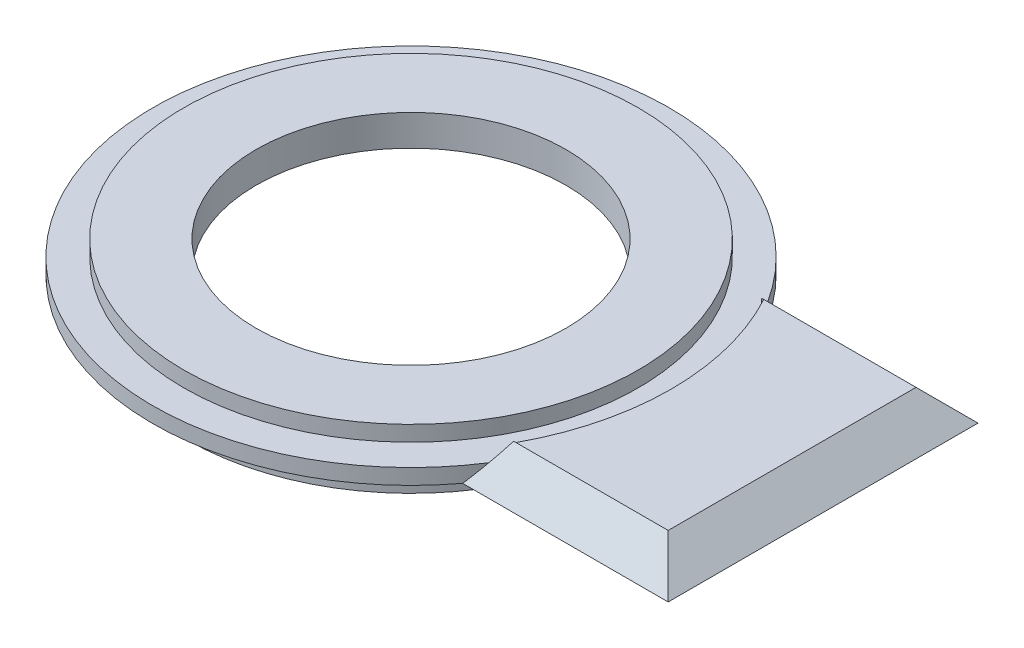
ISO-10303-21;
HEADER;
FILE_DESCRIPTION(('STEP AP214'),'2;1');
FILE_NAME('part.step','',(''),(''),'','','');
FILE_SCHEMA(('AUTOMOTIVE_DESIGN { 1 0 10303 214 1 1 1 1 }'));
ENDSEC;
DATA;
#1=APPLICATION_CONTEXT('core data for automotive mechanical design processes');
#2=APPLICATION_PROTOCOL_DEFINITION('international standard','automotive_design',2000,#1);
#3=PRODUCT_CONTEXT('',#1,'mechanical');
#4=PRODUCT('Part','Part','',(#3));
#5=PRODUCT_RELATED_PRODUCT_CATEGORY('part','',(#4));
#6=PRODUCT_DEFINITION_FORMATION('','',#4);
#7=PRODUCT_DEFINITION_CONTEXT('part definition',#1,'design');
#8=PRODUCT_DEFINITION('design','',#6,#7);
#9=PRODUCT_DEFINITION_SHAPE('','',#8);
#10=(LENGTH_UNIT() NAMED_UNIT(*) SI_UNIT(.MILLI.,.METRE.));
#11=(NAMED_UNIT(*) PLANE_ANGLE_UNIT() SI_UNIT($,.RADIAN.));
#12=(NAMED_UNIT(*) SI_UNIT($,.STERADIAN.) SOLID_ANGLE_UNIT());
#13=UNCERTAINTY_MEASURE_WITH_UNIT(LENGTH_MEASURE(1.E-05),#10,'distance_accuracy_value','');
#14=(GEOMETRIC_REPRESENTATION_CONTEXT(3) GLOBAL_UNCERTAINTY_ASSIGNED_CONTEXT((#13)) GLOBAL_UNIT_ASSIGNED_CONTEXT((#10,
#11,#12)) REPRESENTATION_CONTEXT('',''));
#15=CARTESIAN_POINT('',(0.,0.,0.));
#16=DIRECTION('',(0.,0.,1.));
#17=DIRECTION('',(1.,0.,0.));
#18=AXIS2_PLACEMENT_3D('',#15,#16,#17);
#19=CARTESIAN_POINT('',(0.,3.,0.));
#20=DIRECTION('',(0.,-1.,0.));
#21=DIRECTION('',(0.,0.,-1.));
#22=AXIS2_PLACEMENT_3D('',#19,#20,#21);
#23=CYLINDRICAL_SURFACE('',#22,25.);
#24=CARTESIAN_POINT('',(0.,1.5,0.));
#25=DIRECTION('',(0.,1.,0.));
#26=DIRECTION('',(0.,0.,1.));
#27=AXIS2_PLACEMENT_3D('',#24,#25,#26);
#28=CIRCLE('',#27,25.);
#29=CARTESIAN_POINT('',(21.0416254125008,1.5,-13.5));
#30=VERTEX_POINT('',#29);
#31=CARTESIAN_POINT('',(21.0416254125008,1.5,13.5));
#32=VERTEX_POINT('',#31);
#33=EDGE_CURVE('E196',#30,#32,#28,.T.);
#34=ORIENTED_EDGE('',*,*,#33,.F.);
#35=CARTESIAN_POINT('',(0.,15.,0.));
#36=DIRECTION('',(0.,0.707106781186547,-0.707106781186548));
#37=DIRECTION('',(0.,-0.707106781186548,-0.707106781186547));
#38=AXIS2_PLACEMENT_3D('',#35,#36,#37);
#39=ELLIPSE('',#38,35.3553390593274,25.);
#40=CARTESIAN_POINT('',(20.,0.,-15.));
#41=VERTEX_POINT('',#40);
#42=EDGE_CURVE('E51',#30,#41,#39,.T.);
#43=ORIENTED_EDGE('',*,*,#42,.T.);
#44=CARTESIAN_POINT('',(0.,0.,0.));
#45=DIRECTION('',(0.,1.,0.));
#46=DIRECTION('',(0.,0.,1.));
#47=AXIS2_PLACEMENT_3D('',#44,#45,#46);
#48=CIRCLE('',#47,25.);
#49=CARTESIAN_POINT('',(20.,0.,15.));
#50=VERTEX_POINT('',#49);
#51=EDGE_CURVE('E308',#41,#50,#48,.T.);
#52=ORIENTED_EDGE('',*,*,#51,.T.);
#53=CARTESIAN_POINT('',(0.,15.,0.));
#54=DIRECTION('',(0.,0.707106781186547,0.707106781186548));
#55=DIRECTION('',(0.,-0.707106781186548,0.707106781186547));
#56=AXIS2_PLACEMENT_3D('',#53,#54,#55);
#57=ELLIPSE('',#56,35.3553390593274,25.);
#58=EDGE_CURVE('E334',#50,#32,#57,.T.);
#59=ORIENTED_EDGE('',*,*,#58,.T.);
#60=EDGE_LOOP('',(#34,#43,#52,#59));
#61=FACE_BOUND('',#60,.T.);
#62=ADVANCED_FACE('F40',(#61),#23,.T.);
#63=CARTESIAN_POINT('',(0.,3.,0.));
#64=DIRECTION('',(0.,1.,0.));
#65=DIRECTION('',(0.,0.,1.));
#66=AXIS2_PLACEMENT_3D('',#63,#64,#65);
#67=PLANE('',#66);
#68=CARTESIAN_POINT('',(0.,3.,0.));
#69=DIRECTION('',(0.,-1.,0.));
#70=DIRECTION('',(0.,0.,-1.));
#71=AXIS2_PLACEMENT_3D('',#68,#69,#70);
#72=CIRCLE('',#71,15.);
#73=CARTESIAN_POINT('',(0.,3.,-15.));
#74=VERTEX_POINT('',#73);
#75=EDGE_CURVE('E215',#74,#74,#72,.T.);
#76=ORIENTED_EDGE('',*,*,#75,.T.);
#77=EDGE_LOOP('',(#76));
#78=FACE_BOUND('',#77,.T.);
#79=CARTESIAN_POINT('',(0.,3.,0.));
#80=DIRECTION('',(0.,1.,0.));
#81=DIRECTION('',(0.,0.,1.));
#82=AXIS2_PLACEMENT_3D('',#79,#80,#81);
#83=CIRCLE('',#82,22.);
#84=CARTESIAN_POINT('',(0.,3.,22.));
#85=VERTEX_POINT('',#84);
#86=EDGE_CURVE('E197',#85,#85,#83,.T.);
#87=ORIENTED_EDGE('',*,*,#86,.T.);
#88=EDGE_LOOP('',(#87));
#89=FACE_BOUND('',#88,.T.);
#90=ADVANCED_FACE('F385',(#78,#89),#67,.T.);
#91=CARTESIAN_POINT('',(0.,0.,0.));
#92=DIRECTION('',(0.,1.,0.));
#93=DIRECTION('',(0.,0.,1.));
#94=AXIS2_PLACEMENT_3D('',#91,#92,#93);
#95=PLANE('',#94);
#96=ORIENTED_EDGE('',*,*,#51,.F.);
#97=DIRECTION('',(-1.,0.,0.));
#98=VECTOR('',#97,1.);
#99=CARTESIAN_POINT('',(20.,0.,-15.));
#100=LINE('',#99,#98);
#101=CARTESIAN_POINT('',(39.9,0.,-15.));
#102=VERTEX_POINT('',#101);
#103=EDGE_CURVE('E320',#102,#41,#100,.T.);
#104=ORIENTED_EDGE('',*,*,#103,.F.);
#105=DIRECTION('',(0.,0.,-1.));
#106=VECTOR('',#105,1.);
#107=CARTESIAN_POINT('',(39.9,0.,-15.));
#108=LINE('',#107,#106);
#109=CARTESIAN_POINT('',(39.9,0.,15.));
#110=VERTEX_POINT('',#109);
#111=EDGE_CURVE('E316',#110,#102,#108,.T.);
#112=ORIENTED_EDGE('',*,*,#111,.F.);
#113=DIRECTION('',(1.,0.,0.));
#114=VECTOR('',#113,1.);
#115=CARTESIAN_POINT('',(39.9,0.,15.));
#116=LINE('',#115,#114);
#117=EDGE_CURVE('E312',#50,#110,#116,.T.);
#118=ORIENTED_EDGE('',*,*,#117,.F.);
#119=EDGE_LOOP('',(#96,#104,#112,#118));
#120=FACE_BOUND('',#119,.T.);
#121=CARTESIAN_POINT('',(0.,0.,0.));
#122=DIRECTION('',(0.,-1.,0.));
#123=DIRECTION('',(0.,0.,-1.));
#124=AXIS2_PLACEMENT_3D('',#121,#122,#123);
#125=CIRCLE('',#124,21.7);
#126=CARTESIAN_POINT('',(18.2756668824971,0.,11.7));
#127=VERTEX_POINT('',#126);
#128=CARTESIAN_POINT('',(18.2756668824971,0.,-11.7));
#129=VERTEX_POINT('',#128);
#130=EDGE_CURVE('E263',#127,#129,#125,.T.);
#131=ORIENTED_EDGE('',*,*,#130,.F.);
#132=DIRECTION('',(-1.,0.,0.));
#133=VECTOR('',#132,1.);
#134=CARTESIAN_POINT('',(36.6,0.,11.7));
#135=LINE('',#134,#133);
#136=CARTESIAN_POINT('',(36.6,0.,11.7));
#137=VERTEX_POINT('',#136);
#138=EDGE_CURVE('E269',#137,#127,#135,.T.);
#139=ORIENTED_EDGE('',*,*,#138,.F.);
#140=DIRECTION('',(0.,0.,1.));
#141=VECTOR('',#140,1.);
#142=CARTESIAN_POINT('',(36.6,0.,-11.7));
#143=LINE('',#142,#141);
#144=CARTESIAN_POINT('',(36.6,0.,-11.7));
#145=VERTEX_POINT('',#144);
#146=EDGE_CURVE('E286',#145,#137,#143,.T.);
#147=ORIENTED_EDGE('',*,*,#146,.F.);
#148=DIRECTION('',(1.,0.,0.));
#149=VECTOR('',#148,1.);
#150=CARTESIAN_POINT('',(18.2756668824971,0.,-11.7));
#151=LINE('',#150,#149);
#152=EDGE_CURVE('E282',#129,#145,#151,.T.);
#153=ORIENTED_EDGE('',*,*,#152,.F.);
#154=EDGE_LOOP('',(#131,#139,#147,#153));
#155=FACE_BOUND('',#154,.T.);
#156=ADVANCED_FACE('F363',(#120,#155),#95,.F.);
#157=CARTESIAN_POINT('',(0.,3.,0.));
#158=DIRECTION('',(0.,1.,0.));
#159=DIRECTION('',(0.,0.,1.));
#160=AXIS2_PLACEMENT_3D('',#157,#158,#159);
#161=CIRCLE('',#160,25.2);
#162=CARTESIAN_POINT('',(22.1594223751433,3.,12.));
#163=VERTEX_POINT('',#162);
#164=CARTESIAN_POINT('',(22.1594223751433,3.,-12.));
#165=VERTEX_POINT('',#164);
#166=EDGE_CURVE('E201',#163,#165,#161,.T.);
#167=ORIENTED_EDGE('',*,*,#166,.F.);
#168=DIRECTION('',(1.,0.,0.));
#169=VECTOR('',#168,1.);
#170=CARTESIAN_POINT('',(39.9,3.,12.));
#171=LINE('',#170,#169);
#172=CARTESIAN_POINT('',(36.9,3.,12.));
#173=VERTEX_POINT('',#172);
#174=EDGE_CURVE('E67',#163,#173,#171,.T.);
#175=ORIENTED_EDGE('',*,*,#174,.T.);
#176=DIRECTION('',(0.,0.,-1.));
#177=VECTOR('',#176,1.);
#178=CARTESIAN_POINT('',(36.9,3.,-15.));
#179=LINE('',#178,#177);
#180=CARTESIAN_POINT('',(36.9,3.,-12.));
#181=VERTEX_POINT('',#180);
#182=EDGE_CURVE('E328',#173,#181,#179,.T.);
#183=ORIENTED_EDGE('',*,*,#182,.T.);
#184=DIRECTION('',(-1.,0.,0.));
#185=VECTOR('',#184,1.);
#186=CARTESIAN_POINT('',(20.,3.,-12.));
#187=LINE('',#186,#185);
#188=EDGE_CURVE('E324',#181,#165,#187,.T.);
#189=ORIENTED_EDGE('',*,*,#188,.T.);
#190=EDGE_LOOP('',(#167,#175,#183,#189));
#191=FACE_BOUND('',#190,.T.);
#192=ADVANCED_FACE('F352',(#191),#67,.T.);
#193=CARTESIAN_POINT('',(0.,-3.,0.));
#194=DIRECTION('',(0.,-1.,0.));
#195=DIRECTION('',(0.,0.,-1.));
#196=AXIS2_PLACEMENT_3D('',#193,#194,#195);
#197=PLANE('',#196);
#198=CARTESIAN_POINT('',(0.,-3.,0.));
#199=DIRECTION('',(0.,-1.,0.));
#200=DIRECTION('',(0.,0.,-1.));
#201=AXIS2_PLACEMENT_3D('',#198,#199,#200);
#202=CIRCLE('',#201,21.7);
#203=CARTESIAN_POINT('',(18.2756668824971,-3.,11.7));
#204=VERTEX_POINT('',#203);
#205=CARTESIAN_POINT('',(18.2756668824971,-3.,-11.7));
#206=VERTEX_POINT('',#205);
#207=EDGE_CURVE('E264',#204,#206,#202,.T.);
#208=ORIENTED_EDGE('',*,*,#207,.T.);
#209=DIRECTION('',(1.,0.,0.));
#210=VECTOR('',#209,1.);
#211=CARTESIAN_POINT('',(18.2756668824971,-3.,-11.7));
#212=LINE('',#211,#210);
#213=CARTESIAN_POINT('',(36.6,-3.,-11.7));
#214=VERTEX_POINT('',#213);
#215=EDGE_CURVE('E268',#206,#214,#212,.T.);
#216=ORIENTED_EDGE('',*,*,#215,.T.);
#217=DIRECTION('',(0.,0.,1.));
#218=VECTOR('',#217,1.);
#219=CARTESIAN_POINT('',(36.6,-3.,-11.7));
#220=LINE('',#219,#218);
#221=CARTESIAN_POINT('',(36.6,-3.,11.7));
#222=VERTEX_POINT('',#221);
#223=EDGE_CURVE('E272',#214,#222,#220,.T.);
#224=ORIENTED_EDGE('',*,*,#223,.T.);
#225=DIRECTION('',(-1.,0.,0.));
#226=VECTOR('',#225,1.);
#227=CARTESIAN_POINT('',(36.6,-3.,11.7));
#228=LINE('',#227,#226);
#229=EDGE_CURVE('E275',#222,#204,#228,.T.);
#230=ORIENTED_EDGE('',*,*,#229,.T.);
#231=EDGE_LOOP('',(#208,#216,#224,#230));
#232=FACE_BOUND('',#231,.T.);
#233=DIRECTION('',(1.,0.,0.));
#234=VECTOR('',#233,1.);
#235=CARTESIAN_POINT('',(17.1464281994822,-3.,-9.7));
#236=LINE('',#235,#234);
#237=CARTESIAN_POINT('',(17.1464281994822,-3.,-9.7));
#238=VERTEX_POINT('',#237);
#239=CARTESIAN_POINT('',(34.6,-3.,-9.7));
#240=VERTEX_POINT('',#239);
#241=EDGE_CURVE('E226',#238,#240,#236,.T.);
#242=ORIENTED_EDGE('',*,*,#241,.F.);
#243=CARTESIAN_POINT('',(0.,-3.,0.));
#244=DIRECTION('',(0.,-1.,0.));
#245=DIRECTION('',(0.,0.,-1.));
#246=AXIS2_PLACEMENT_3D('',#243,#244,#245);
#247=CIRCLE('',#246,19.7);
#248=CARTESIAN_POINT('',(17.1464281994822,-3.,9.7));
#249=VERTEX_POINT('',#248);
#250=EDGE_CURVE('E223',#249,#238,#247,.T.);
#251=ORIENTED_EDGE('',*,*,#250,.F.);
#252=DIRECTION('',(-1.,0.,0.));
#253=VECTOR('',#252,1.);
#254=CARTESIAN_POINT('',(34.6,-3.,9.7));
#255=LINE('',#254,#253);
#256=CARTESIAN_POINT('',(34.6,-3.,9.7));
#257=VERTEX_POINT('',#256);
#258=EDGE_CURVE('E234',#257,#249,#255,.T.);
#259=ORIENTED_EDGE('',*,*,#258,.F.);
#260=DIRECTION('',(0.,0.,1.));
#261=VECTOR('',#260,1.);
#262=CARTESIAN_POINT('',(34.6,-3.,-9.7));
#263=LINE('',#262,#261);
#264=EDGE_CURVE('E230',#240,#257,#263,.T.);
#265=ORIENTED_EDGE('',*,*,#264,.F.);
#266=EDGE_LOOP('',(#242,#251,#259,#265));
#267=FACE_BOUND('',#266,.T.);
#268=ADVANCED_FACE('F437',(#232,#267),#197,.T.);
#269=CARTESIAN_POINT('',(0.,-3.,0.));
#270=DIRECTION('',(0.,1.,0.));
#271=DIRECTION('',(0.,0.,1.));
#272=AXIS2_PLACEMENT_3D('',#269,#270,#271);
#273=CYLINDRICAL_SURFACE('',#272,21.7);
#274=ORIENTED_EDGE('',*,*,#130,.T.);
#275=DIRECTION('',(0.,1.,0.));
#276=VECTOR('',#275,1.);
#277=CARTESIAN_POINT('',(18.2756668824971,-3.,-11.7));
#278=LINE('',#277,#276);
#279=EDGE_CURVE('E304',#206,#129,#278,.T.);
#280=ORIENTED_EDGE('',*,*,#279,.F.);
#281=ORIENTED_EDGE('',*,*,#207,.F.);
#282=DIRECTION('',(0.,1.,0.));
#283=VECTOR('',#282,1.);
#284=CARTESIAN_POINT('',(18.2756668824971,-3.,11.7));
#285=LINE('',#284,#283);
#286=EDGE_CURVE('E278',#204,#127,#285,.T.);
#287=ORIENTED_EDGE('',*,*,#286,.T.);
#288=EDGE_LOOP('',(#274,#280,#281,#287));
#289=FACE_BOUND('',#288,.T.);
#290=ADVANCED_FACE('F440',(#289),#273,.T.);
#291=CARTESIAN_POINT('',(18.2756668824971,-3.,-11.7));
#292=DIRECTION('',(0.,0.,1.));
#293=DIRECTION('',(1.,0.,0.));
#294=AXIS2_PLACEMENT_3D('',#291,#292,#293);
#295=PLANE('',#294);
#296=ORIENTED_EDGE('',*,*,#152,.T.);
#297=DIRECTION('',(0.,1.,0.));
#298=VECTOR('',#297,1.);
#299=CARTESIAN_POINT('',(36.6,-3.,-11.7));
#300=LINE('',#299,#298);
#301=EDGE_CURVE('E300',#214,#145,#300,.T.);
#302=ORIENTED_EDGE('',*,*,#301,.F.);
#303=ORIENTED_EDGE('',*,*,#215,.F.);
#304=ORIENTED_EDGE('',*,*,#279,.T.);
#305=EDGE_LOOP('',(#296,#302,#303,#304));
#306=FACE_BOUND('',#305,.T.);
#307=ADVANCED_FACE('F448',(#306),#295,.F.);
#308=CARTESIAN_POINT('',(36.6,-3.,-11.7));
#309=DIRECTION('',(-1.,0.,0.));
#310=DIRECTION('',(0.,0.,1.));
#311=AXIS2_PLACEMENT_3D('',#308,#309,#310);
#312=PLANE('',#311);
#313=ORIENTED_EDGE('',*,*,#146,.T.);
#314=DIRECTION('',(0.,1.,0.));
#315=VECTOR('',#314,1.);
#316=CARTESIAN_POINT('',(36.6,-3.,11.7));
#317=LINE('',#316,#315);
#318=EDGE_CURVE('E296',#222,#137,#317,.T.);
#319=ORIENTED_EDGE('',*,*,#318,.F.);
#320=ORIENTED_EDGE('',*,*,#223,.F.);
#321=ORIENTED_EDGE('',*,*,#301,.T.);
#322=EDGE_LOOP('',(#313,#319,#320,#321));
#323=FACE_BOUND('',#322,.T.);
#324=ADVANCED_FACE('F444',(#323),#312,.F.);
#325=CARTESIAN_POINT('',(36.6,-3.,11.7));
#326=DIRECTION('',(0.,0.,-1.));
#327=DIRECTION('',(-1.,0.,0.));
#328=AXIS2_PLACEMENT_3D('',#325,#326,#327);
#329=PLANE('',#328);
#330=ORIENTED_EDGE('',*,*,#138,.T.);
#331=ORIENTED_EDGE('',*,*,#286,.F.);
#332=ORIENTED_EDGE('',*,*,#229,.F.);
#333=ORIENTED_EDGE('',*,*,#318,.T.);
#334=EDGE_LOOP('',(#330,#331,#332,#333));
#335=FACE_BOUND('',#334,.T.);
#336=ADVANCED_FACE('F435',(#335),#329,.F.);
#337=CARTESIAN_POINT('',(0.,-3.,0.));
#338=DIRECTION('',(0.,1.,0.));
#339=DIRECTION('',(0.,0.,1.));
#340=AXIS2_PLACEMENT_3D('',#337,#338,#339);
#341=CYLINDRICAL_SURFACE('',#340,19.7);
#342=CARTESIAN_POINT('',(0.,0.,0.));
#343=DIRECTION('',(0.,-1.,0.));
#344=DIRECTION('',(0.,0.,-1.));
#345=AXIS2_PLACEMENT_3D('',#342,#343,#344);
#346=CIRCLE('',#345,19.7);
#347=CARTESIAN_POINT('',(17.1464281994822,0.,9.7));
#348=VERTEX_POINT('',#347);
#349=CARTESIAN_POINT('',(17.1464281994822,0.,-9.7));
#350=VERTEX_POINT('',#349);
#351=EDGE_CURVE('E218',#348,#350,#346,.T.);
#352=ORIENTED_EDGE('',*,*,#351,.F.);
#353=DIRECTION('',(0.,1.,0.));
#354=VECTOR('',#353,1.);
#355=CARTESIAN_POINT('',(17.1464281994822,-3.,9.7));
#356=LINE('',#355,#354);
#357=EDGE_CURVE('E237',#249,#348,#356,.T.);
#358=ORIENTED_EDGE('',*,*,#357,.F.);
#359=ORIENTED_EDGE('',*,*,#250,.T.);
#360=DIRECTION('',(0.,1.,0.));
#361=VECTOR('',#360,1.);
#362=CARTESIAN_POINT('',(17.1464281994822,-3.,-9.7));
#363=LINE('',#362,#361);
#364=EDGE_CURVE('E259',#238,#350,#363,.T.);
#365=ORIENTED_EDGE('',*,*,#364,.T.);
#366=EDGE_LOOP('',(#352,#358,#359,#365));
#367=FACE_BOUND('',#366,.T.);
#368=ADVANCED_FACE('F431',(#367),#341,.F.);
#369=CARTESIAN_POINT('',(17.1464281994822,-3.,-9.7));
#370=DIRECTION('',(0.,0.,1.));
#371=DIRECTION('',(1.,0.,0.));
#372=AXIS2_PLACEMENT_3D('',#369,#370,#371);
#373=PLANE('',#372);
#374=DIRECTION('',(1.,0.,0.));
#375=VECTOR('',#374,1.);
#376=CARTESIAN_POINT('',(17.1464281994822,0.,-9.7));
#377=LINE('',#376,#375);
#378=CARTESIAN_POINT('',(34.6,0.,-9.7));
#379=VERTEX_POINT('',#378);
#380=EDGE_CURVE('E241',#350,#379,#377,.T.);
#381=ORIENTED_EDGE('',*,*,#380,.F.);
#382=ORIENTED_EDGE('',*,*,#364,.F.);
#383=ORIENTED_EDGE('',*,*,#241,.T.);
#384=DIRECTION('',(0.,1.,0.));
#385=VECTOR('',#384,1.);
#386=CARTESIAN_POINT('',(34.6,-3.,-9.7));
#387=LINE('',#386,#385);
#388=EDGE_CURVE('E256',#240,#379,#387,.T.);
#389=ORIENTED_EDGE('',*,*,#388,.T.);
#390=EDGE_LOOP('',(#381,#382,#383,#389));
#391=FACE_BOUND('',#390,.T.);
#392=ADVANCED_FACE('F427',(#391),#373,.T.);
#393=CARTESIAN_POINT('',(34.6,-3.,-9.7));
#394=DIRECTION('',(-1.,0.,0.));
#395=DIRECTION('',(0.,0.,1.));
#396=AXIS2_PLACEMENT_3D('',#393,#394,#395);
#397=PLANE('',#396);
#398=DIRECTION('',(0.,0.,1.));
#399=VECTOR('',#398,1.);
#400=CARTESIAN_POINT('',(34.6,0.,-9.7));
#401=LINE('',#400,#399);
#402=CARTESIAN_POINT('',(34.6,0.,9.7));
#403=VERTEX_POINT('',#402);
#404=EDGE_CURVE('E245',#379,#403,#401,.T.);
#405=ORIENTED_EDGE('',*,*,#404,.F.);
#406=ORIENTED_EDGE('',*,*,#388,.F.);
#407=ORIENTED_EDGE('',*,*,#264,.T.);
#408=DIRECTION('',(0.,1.,0.));
#409=VECTOR('',#408,1.);
#410=CARTESIAN_POINT('',(34.6,-3.,9.7));
#411=LINE('',#410,#409);
#412=EDGE_CURVE('E253',#257,#403,#411,.T.);
#413=ORIENTED_EDGE('',*,*,#412,.T.);
#414=EDGE_LOOP('',(#405,#406,#407,#413));
#415=FACE_BOUND('',#414,.T.);
#416=ADVANCED_FACE('F423',(#415),#397,.T.);
#417=CARTESIAN_POINT('',(34.6,-3.,9.7));
#418=DIRECTION('',(0.,0.,-1.));
#419=DIRECTION('',(-1.,0.,0.));
#420=AXIS2_PLACEMENT_3D('',#417,#418,#419);
#421=PLANE('',#420);
#422=DIRECTION('',(-1.,0.,0.));
#423=VECTOR('',#422,1.);
#424=CARTESIAN_POINT('',(34.6,0.,9.7));
#425=LINE('',#424,#423);
#426=EDGE_CURVE('E227',#403,#348,#425,.T.);
#427=ORIENTED_EDGE('',*,*,#426,.F.);
#428=ORIENTED_EDGE('',*,*,#412,.F.);
#429=ORIENTED_EDGE('',*,*,#258,.T.);
#430=ORIENTED_EDGE('',*,*,#357,.T.);
#431=EDGE_LOOP('',(#427,#428,#429,#430));
#432=FACE_BOUND('',#431,.T.);
#433=ADVANCED_FACE('F415',(#432),#421,.T.);
#434=CARTESIAN_POINT('',(0.,0.,0.));
#435=DIRECTION('',(0.,-1.,0.));
#436=DIRECTION('',(0.,0.,-1.));
#437=AXIS2_PLACEMENT_3D('',#434,#435,#436);
#438=CIRCLE('',#437,15.);
#439=CARTESIAN_POINT('',(0.,0.,-15.));
#440=VERTEX_POINT('',#439);
#441=EDGE_CURVE('E219',#440,#440,#438,.T.);
#442=ORIENTED_EDGE('',*,*,#441,.F.);
#443=EDGE_LOOP('',(#442));
#444=FACE_BOUND('',#443,.T.);
#445=ORIENTED_EDGE('',*,*,#426,.T.);
#446=ORIENTED_EDGE('',*,*,#351,.T.);
#447=ORIENTED_EDGE('',*,*,#380,.T.);
#448=ORIENTED_EDGE('',*,*,#404,.T.);
#449=EDGE_LOOP('',(#445,#446,#447,#448));
#450=FACE_BOUND('',#449,.T.);
#451=ADVANCED_FACE('F394',(#444,#450),#95,.F.);
#452=CARTESIAN_POINT('',(0.,3.,0.));
#453=DIRECTION('',(0.,-1.,0.));
#454=DIRECTION('',(0.,0.,-1.));
#455=AXIS2_PLACEMENT_3D('',#452,#453,#454);
#456=CYLINDRICAL_SURFACE('',#455,15.);
#457=ORIENTED_EDGE('',*,*,#75,.F.);
#458=EDGE_LOOP('',(#457));
#459=FACE_BOUND('',#458,.T.);
#460=ORIENTED_EDGE('',*,*,#441,.T.);
#461=EDGE_LOOP('',(#460));
#462=FACE_BOUND('',#461,.T.);
#463=ADVANCED_FACE('F406',(#459,#462),#456,.F.);
#464=CARTESIAN_POINT('',(0.,3.,-12.));
#465=DIRECTION('',(0.,0.707106781186547,-0.707106781186548));
#466=DIRECTION('',(1.,0.,0.));
#467=AXIS2_PLACEMENT_3D('',#464,#465,#466);
#468=PLANE('',#467);
#469=CARTESIAN_POINT('',(21.9317121994613,3.,-12.));
#470=VERTEX_POINT('',#469);
#471=EDGE_CURVE('E11',#470,#30,#39,.T.);
#472=ORIENTED_EDGE('',*,*,#471,.F.);
#473=DIRECTION('',(-1.,0.,0.));
#474=VECTOR('',#473,1.);
#475=CARTESIAN_POINT('',(0.,3.,-12.));
#476=LINE('',#475,#474);
#477=EDGE_CURVE('E188',#165,#470,#476,.T.);
#478=ORIENTED_EDGE('',*,*,#477,.F.);
#479=ORIENTED_EDGE('',*,*,#188,.F.);
#480=DIRECTION('',(0.577350269189624,-0.577350269189627,-0.577350269189626));
#481=VECTOR('',#480,1.);
#482=CARTESIAN_POINT('',(24.6000000000001,15.3,0.299999999999983));
#483=LINE('',#482,#481);
#484=EDGE_CURVE('E45',#102,#181,#483,.F.);
#485=ORIENTED_EDGE('',*,*,#484,.F.);
#486=ORIENTED_EDGE('',*,*,#103,.T.);
#487=ORIENTED_EDGE('',*,*,#42,.F.);
#488=EDGE_LOOP('',(#472,#478,#479,#485,#486,#487));
#489=FACE_BOUND('',#488,.T.);
#490=ADVANCED_FACE('F43',(#489),#468,.T.);
#491=CARTESIAN_POINT('',(36.9,3.,0.));
#492=DIRECTION('',(0.707106781186549,0.707106781186545,0.));
#493=DIRECTION('',(0.,0.,1.));
#494=AXIS2_PLACEMENT_3D('',#491,#492,#493);
#495=PLANE('',#494);
#496=ORIENTED_EDGE('',*,*,#484,.T.);
#497=ORIENTED_EDGE('',*,*,#182,.F.);
#498=DIRECTION('',(0.577350269189624,-0.577350269189627,0.577350269189626));
#499=VECTOR('',#498,1.);
#500=CARTESIAN_POINT('',(32.9,7.00000000000001,7.99999999999998));
#501=LINE('',#500,#499);
#502=EDGE_CURVE('E209',#110,#173,#501,.F.);
#503=ORIENTED_EDGE('',*,*,#502,.F.);
#504=ORIENTED_EDGE('',*,*,#111,.T.);
#505=EDGE_LOOP('',(#496,#497,#503,#504));
#506=FACE_BOUND('',#505,.T.);
#507=ADVANCED_FACE('F346',(#506),#495,.T.);
#508=CARTESIAN_POINT('',(0.,3.,12.));
#509=DIRECTION('',(0.,0.707106781186547,0.707106781186548));
#510=DIRECTION('',(-1.,0.,0.));
#511=AXIS2_PLACEMENT_3D('',#508,#509,#510);
#512=PLANE('',#511);
#513=ORIENTED_EDGE('',*,*,#58,.F.);
#514=ORIENTED_EDGE('',*,*,#117,.T.);
#515=ORIENTED_EDGE('',*,*,#502,.T.);
#516=ORIENTED_EDGE('',*,*,#174,.F.);
#517=CARTESIAN_POINT('',(21.9317121994613,3.,12.));
#518=VERTEX_POINT('',#517);
#519=EDGE_CURVE('E162',#518,#163,#171,.T.);
#520=ORIENTED_EDGE('',*,*,#519,.F.);
#521=EDGE_CURVE('E333',#32,#518,#57,.T.);
#522=ORIENTED_EDGE('',*,*,#521,.F.);
#523=EDGE_LOOP('',(#513,#514,#515,#516,#520,#522));
#524=FACE_BOUND('',#523,.T.);
#525=ADVANCED_FACE('F354',(#524),#512,.T.);
#526=CARTESIAN_POINT('',(0.,1.5,0.));
#527=DIRECTION('',(0.,1.,0.));
#528=DIRECTION('',(0.,0.,1.));
#529=AXIS2_PLACEMENT_3D('',#526,#527,#528);
#530=CYLINDRICAL_SURFACE('',#529,25.);
#531=ORIENTED_EDGE('',*,*,#471,.T.);
#532=CARTESIAN_POINT('',(21.9317121994613,1.5,-12.));
#533=VERTEX_POINT('',#532);
#534=EDGE_CURVE('E167',#533,#30,#28,.T.);
#535=ORIENTED_EDGE('',*,*,#534,.F.);
#536=DIRECTION('',(0.,1.,0.));
#537=VECTOR('',#536,1.);
#538=CARTESIAN_POINT('',(21.9317121994613,1.5,-12.));
#539=LINE('',#538,#537);
#540=EDGE_CURVE('E210',#533,#470,#539,.T.);
#541=ORIENTED_EDGE('',*,*,#540,.T.);
#542=EDGE_LOOP('',(#531,#535,#541));
#543=FACE_BOUND('',#542,.T.);
#544=ADVANCED_FACE('F370',(#543),#530,.F.);
#545=CARTESIAN_POINT('',(0.,1.5,12.));
#546=DIRECTION('',(0.,0.,1.));
#547=DIRECTION('',(1.,0.,0.));
#548=AXIS2_PLACEMENT_3D('',#545,#546,#547);
#549=PLANE('',#548);
#550=ORIENTED_EDGE('',*,*,#519,.T.);
#551=DIRECTION('',(0.,1.,0.));
#552=VECTOR('',#551,1.);
#553=CARTESIAN_POINT('',(22.1594223751433,1.5,12.));
#554=LINE('',#553,#552);
#555=CARTESIAN_POINT('',(22.1594223751433,1.5,12.));
#556=VERTEX_POINT('',#555);
#557=EDGE_CURVE('E156',#556,#163,#554,.T.);
#558=ORIENTED_EDGE('',*,*,#557,.F.);
#559=DIRECTION('',(1.,0.,0.));
#560=VECTOR('',#559,1.);
#561=CARTESIAN_POINT('',(0.,1.5,12.));
#562=LINE('',#561,#560);
#563=CARTESIAN_POINT('',(21.9317121994613,1.5,12.));
#564=VERTEX_POINT('',#563);
#565=EDGE_CURVE('E160',#564,#556,#562,.T.);
#566=ORIENTED_EDGE('',*,*,#565,.F.);
#567=DIRECTION('',(0.,1.,0.));
#568=VECTOR('',#567,1.);
#569=CARTESIAN_POINT('',(21.9317121994613,1.5,12.));
#570=LINE('',#569,#568);
#571=EDGE_CURVE('E59',#564,#518,#570,.T.);
#572=ORIENTED_EDGE('',*,*,#571,.T.);
#573=EDGE_LOOP('',(#550,#558,#566,#572));
#574=FACE_BOUND('',#573,.T.);
#575=ADVANCED_FACE('F158',(#574),#549,.F.);
#576=ORIENTED_EDGE('',*,*,#521,.T.);
#577=ORIENTED_EDGE('',*,*,#571,.F.);
#578=EDGE_CURVE('E180',#32,#564,#28,.T.);
#579=ORIENTED_EDGE('',*,*,#578,.F.);
#580=EDGE_LOOP('',(#576,#577,#579));
#581=FACE_BOUND('',#580,.T.);
#582=ADVANCED_FACE('F366',(#581),#530,.F.);
#583=CARTESIAN_POINT('',(0.,1.5,-12.));
#584=DIRECTION('',(0.,0.,-1.));
#585=DIRECTION('',(-1.,0.,0.));
#586=AXIS2_PLACEMENT_3D('',#583,#584,#585);
#587=PLANE('',#586);
#588=ORIENTED_EDGE('',*,*,#477,.T.);
#589=ORIENTED_EDGE('',*,*,#540,.F.);
#590=DIRECTION('',(-1.,0.,0.));
#591=VECTOR('',#590,1.);
#592=CARTESIAN_POINT('',(0.,1.5,-12.));
#593=LINE('',#592,#591);
#594=CARTESIAN_POINT('',(22.1594223751433,1.5,-12.));
#595=VERTEX_POINT('',#594);
#596=EDGE_CURVE('E176',#595,#533,#593,.T.);
#597=ORIENTED_EDGE('',*,*,#596,.F.);
#598=DIRECTION('',(0.,1.,0.));
#599=VECTOR('',#598,1.);
#600=CARTESIAN_POINT('',(22.1594223751433,1.5,-12.));
#601=LINE('',#600,#599);
#602=EDGE_CURVE('E166',#595,#165,#601,.T.);
#603=ORIENTED_EDGE('',*,*,#602,.T.);
#604=EDGE_LOOP('',(#588,#589,#597,#603));
#605=FACE_BOUND('',#604,.T.);
#606=ADVANCED_FACE('F372',(#605),#587,.F.);
#607=CARTESIAN_POINT('',(0.,1.5,0.));
#608=DIRECTION('',(0.,1.,0.));
#609=DIRECTION('',(0.,0.,1.));
#610=AXIS2_PLACEMENT_3D('',#607,#608,#609);
#611=CYLINDRICAL_SURFACE('',#610,22.);
#612=CARTESIAN_POINT('',(0.,1.5,0.));
#613=DIRECTION('',(0.,1.,0.));
#614=DIRECTION('',(0.,0.,1.));
#615=AXIS2_PLACEMENT_3D('',#612,#613,#614);
#616=CIRCLE('',#615,22.);
#617=CARTESIAN_POINT('',(0.,1.5,22.));
#618=VERTEX_POINT('',#617);
#619=EDGE_CURVE('E182',#618,#618,#616,.T.);
#620=ORIENTED_EDGE('',*,*,#619,.T.);
#621=EDGE_LOOP('',(#620));
#622=FACE_BOUND('',#621,.T.);
#623=ORIENTED_EDGE('',*,*,#86,.F.);
#624=EDGE_LOOP('',(#623));
#625=FACE_BOUND('',#624,.T.);
#626=ADVANCED_FACE('F374',(#622,#625),#611,.T.);
#627=CARTESIAN_POINT('',(0.,1.5,0.));
#628=DIRECTION('',(0.,1.,0.));
#629=DIRECTION('',(0.,0.,1.));
#630=AXIS2_PLACEMENT_3D('',#627,#628,#629);
#631=CYLINDRICAL_SURFACE('',#630,25.2);
#632=ORIENTED_EDGE('',*,*,#166,.T.);
#633=ORIENTED_EDGE('',*,*,#602,.F.);
#634=CARTESIAN_POINT('',(0.,1.5,0.));
#635=DIRECTION('',(0.,1.,0.));
#636=DIRECTION('',(0.,0.,1.));
#637=AXIS2_PLACEMENT_3D('',#634,#635,#636);
#638=CIRCLE('',#637,25.2);
#639=EDGE_CURVE('E170',#556,#595,#638,.T.);
#640=ORIENTED_EDGE('',*,*,#639,.F.);
#641=ORIENTED_EDGE('',*,*,#557,.T.);
#642=EDGE_LOOP('',(#632,#633,#640,#641));
#643=FACE_BOUND('',#642,.T.);
#644=ADVANCED_FACE('F171',(#643),#631,.F.);
#645=CARTESIAN_POINT('',(0.,1.5,0.));
#646=DIRECTION('',(0.,1.,0.));
#647=DIRECTION('',(0.,0.,1.));
#648=AXIS2_PLACEMENT_3D('',#645,#646,#647);
#649=PLANE('',#648);
#650=ORIENTED_EDGE('',*,*,#619,.F.);
#651=EDGE_LOOP('',(#650));
#652=FACE_BOUND('',#651,.T.);
#653=ORIENTED_EDGE('',*,*,#565,.T.);
#654=ORIENTED_EDGE('',*,*,#639,.T.);
#655=ORIENTED_EDGE('',*,*,#596,.T.);
#656=ORIENTED_EDGE('',*,*,#534,.T.);
#657=ORIENTED_EDGE('',*,*,#33,.T.);
#658=ORIENTED_EDGE('',*,*,#578,.T.);
#659=EDGE_LOOP('',(#653,#654,#655,#656,#657,#658));
#660=FACE_BOUND('',#659,.T.);
#661=ADVANCED_FACE('F178',(#652,#660),#649,.T.);
#662=CLOSED_SHELL('',(#62,#90,#156,#192,#268,#290,#307,#324,#336,#368,#392,#416,#433,#451,#463,
#490,#507,#525,#544,#575,#582,#606,#626,#644,#661));
#663=MANIFOLD_SOLID_BREP('B2',#662);
#664=ADVANCED_BREP_SHAPE_REPRESENTATION('',(#18,#663),#14);
#665=SHAPE_DEFINITION_REPRESENTATION(#9,#664);
ENDSEC;
END-ISO-10303-21;
